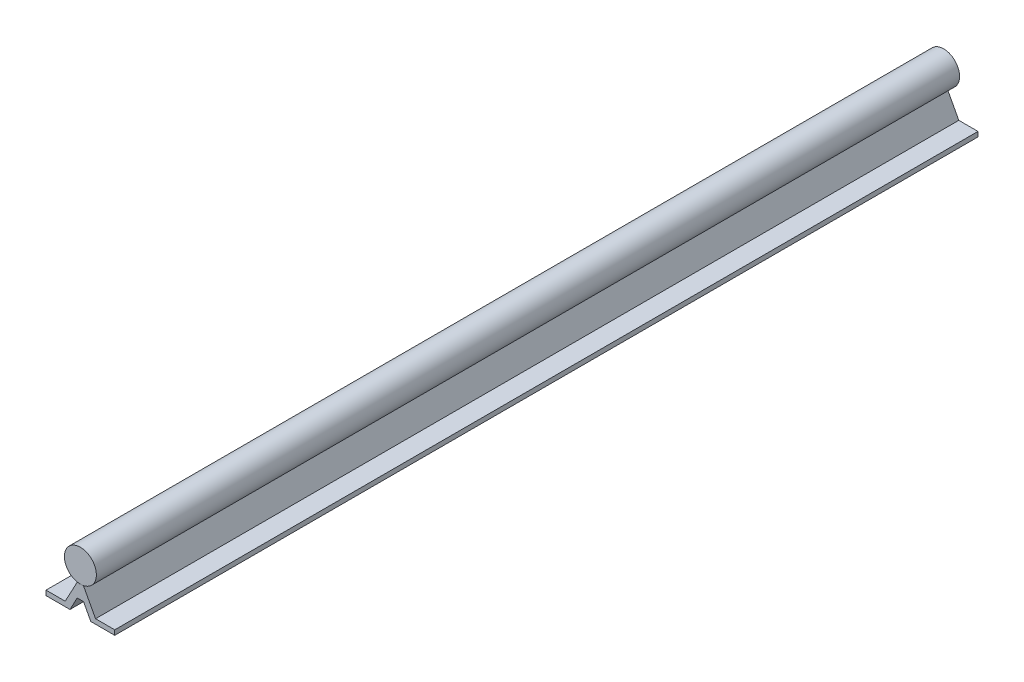
ISO-10303-21;
HEADER;
FILE_DESCRIPTION(('STEP AP214'),'2;1');
FILE_NAME('part.step','',(''),(''),'','','');
FILE_SCHEMA(('AUTOMOTIVE_DESIGN { 1 0 10303 214 1 1 1 1 }'));
ENDSEC;
DATA;
#1=APPLICATION_CONTEXT('core data for automotive mechanical design processes');
#2=APPLICATION_PROTOCOL_DEFINITION('international standard','automotive_design',2000,#1);
#3=PRODUCT_CONTEXT('',#1,'mechanical');
#4=PRODUCT('Part','Part','',(#3));
#5=PRODUCT_RELATED_PRODUCT_CATEGORY('part','',(#4));
#6=PRODUCT_DEFINITION_FORMATION('','',#4);
#7=PRODUCT_DEFINITION_CONTEXT('part definition',#1,'design');
#8=PRODUCT_DEFINITION('design','',#6,#7);
#9=PRODUCT_DEFINITION_SHAPE('','',#8);
#10=(LENGTH_UNIT() NAMED_UNIT(*) SI_UNIT(.MILLI.,.METRE.));
#11=(NAMED_UNIT(*) PLANE_ANGLE_UNIT() SI_UNIT($,.RADIAN.));
#12=(NAMED_UNIT(*) SI_UNIT($,.STERADIAN.) SOLID_ANGLE_UNIT());
#13=UNCERTAINTY_MEASURE_WITH_UNIT(LENGTH_MEASURE(1.E-05),#10,'distance_accuracy_value','');
#14=(GEOMETRIC_REPRESENTATION_CONTEXT(3) GLOBAL_UNCERTAINTY_ASSIGNED_CONTEXT((#13)) GLOBAL_UNIT_ASSIGNED_CONTEXT((#10,
#11,#12)) REPRESENTATION_CONTEXT('',''));
#15=CARTESIAN_POINT('',(0.,0.,0.));
#16=DIRECTION('',(0.,0.,1.));
#17=DIRECTION('',(1.,0.,0.));
#18=AXIS2_PLACEMENT_3D('',#15,#16,#17);
#19=CARTESIAN_POINT('',(-5.07702702702703,2.68783783783784,540.));
#20=DIRECTION('',(-0.883787916347062,0.467887720419033,0.));
#21=DIRECTION('',(-0.467887720419033,-0.883787916347062,0.));
#22=AXIS2_PLACEMENT_3D('',#19,#20,#21);
#23=PLANE('',#22);
#24=DIRECTION('',(0.467887720419033,0.883787916347062,0.));
#25=VECTOR('',#24,1.);
#26=CARTESIAN_POINT('',(-5.07702702702703,2.68783783783784,0.));
#27=LINE('',#26,#25);
#28=CARTESIAN_POINT('',(-6.5,0.,0.));
#29=VERTEX_POINT('',#28);
#30=CARTESIAN_POINT('',(-2.,8.5,0.));
#31=VERTEX_POINT('',#30);
#32=EDGE_CURVE('E167',#29,#31,#27,.T.);
#33=ORIENTED_EDGE('',*,*,#32,.T.);
#34=DIRECTION('',(0.,0.,-1.));
#35=VECTOR('',#34,1.);
#36=CARTESIAN_POINT('',(-2.,8.5,540.));
#37=LINE('',#36,#35);
#38=CARTESIAN_POINT('',(-2.,8.5,540.));
#39=VERTEX_POINT('',#38);
#40=EDGE_CURVE('E12',#39,#31,#37,.T.);
#41=ORIENTED_EDGE('',*,*,#40,.F.);
#42=DIRECTION('',(0.467887720419033,0.883787916347062,0.));
#43=VECTOR('',#42,1.);
#44=CARTESIAN_POINT('',(-5.07702702702703,2.68783783783784,540.));
#45=LINE('',#44,#43);
#46=CARTESIAN_POINT('',(-6.5,0.,540.));
#47=VERTEX_POINT('',#46);
#48=EDGE_CURVE('E197',#47,#39,#45,.T.);
#49=ORIENTED_EDGE('',*,*,#48,.F.);
#50=DIRECTION('',(0.,0.,-1.));
#51=VECTOR('',#50,1.);
#52=CARTESIAN_POINT('',(-6.5,0.,540.));
#53=LINE('',#52,#51);
#54=EDGE_CURVE('E63',#47,#29,#53,.T.);
#55=ORIENTED_EDGE('',*,*,#54,.T.);
#56=EDGE_LOOP('',(#33,#41,#49,#55));
#57=FACE_BOUND('',#56,.T.);
#58=ADVANCED_FACE('F47',(#57),#23,.F.);
#59=CARTESIAN_POINT('',(0.,8.5,540.));
#60=DIRECTION('',(0.,1.,0.));
#61=DIRECTION('',(0.,0.,1.));
#62=AXIS2_PLACEMENT_3D('',#59,#60,#61);
#63=PLANE('',#62);
#64=DIRECTION('',(1.,0.,0.));
#65=VECTOR('',#64,1.);
#66=CARTESIAN_POINT('',(0.,8.5,0.));
#67=LINE('',#66,#65);
#68=CARTESIAN_POINT('',(2.,8.5,0.));
#69=VERTEX_POINT('',#68);
#70=EDGE_CURVE('E169',#31,#69,#67,.T.);
#71=ORIENTED_EDGE('',*,*,#70,.T.);
#72=DIRECTION('',(0.,0.,-1.));
#73=VECTOR('',#72,1.);
#74=CARTESIAN_POINT('',(2.,8.5,540.));
#75=LINE('',#74,#73);
#76=CARTESIAN_POINT('',(2.,8.5,540.));
#77=VERTEX_POINT('',#76);
#78=EDGE_CURVE('E55',#77,#69,#75,.T.);
#79=ORIENTED_EDGE('',*,*,#78,.F.);
#80=DIRECTION('',(1.,0.,0.));
#81=VECTOR('',#80,1.);
#82=CARTESIAN_POINT('',(0.,8.5,540.));
#83=LINE('',#82,#81);
#84=EDGE_CURVE('E113',#39,#77,#83,.T.);
#85=ORIENTED_EDGE('',*,*,#84,.F.);
#86=ORIENTED_EDGE('',*,*,#40,.T.);
#87=EDGE_LOOP('',(#71,#79,#85,#86));
#88=FACE_BOUND('',#87,.T.);
#89=ADVANCED_FACE('F220',(#88),#63,.F.);
#90=CARTESIAN_POINT('',(5.07702702702703,2.68783783783784,540.));
#91=DIRECTION('',(-0.883787916347062,-0.467887720419032,0.));
#92=DIRECTION('',(0.467887720419032,-0.883787916347062,0.));
#93=AXIS2_PLACEMENT_3D('',#90,#91,#92);
#94=PLANE('',#93);
#95=DIRECTION('',(-0.467887720419032,0.883787916347062,0.));
#96=VECTOR('',#95,1.);
#97=CARTESIAN_POINT('',(5.07702702702703,2.68783783783784,0.));
#98=LINE('',#97,#96);
#99=CARTESIAN_POINT('',(6.5,0.,0.));
#100=VERTEX_POINT('',#99);
#101=EDGE_CURVE('E172',#100,#69,#98,.T.);
#102=ORIENTED_EDGE('',*,*,#101,.F.);
#103=DIRECTION('',(0.,0.,-1.));
#104=VECTOR('',#103,1.);
#105=CARTESIAN_POINT('',(6.5,0.,540.));
#106=LINE('',#105,#104);
#107=CARTESIAN_POINT('',(6.5,0.,540.));
#108=VERTEX_POINT('',#107);
#109=EDGE_CURVE('E213',#108,#100,#106,.T.);
#110=ORIENTED_EDGE('',*,*,#109,.F.);
#111=DIRECTION('',(-0.467887720419032,0.883787916347062,0.));
#112=VECTOR('',#111,1.);
#113=CARTESIAN_POINT('',(5.07702702702703,2.68783783783784,540.));
#114=LINE('',#113,#112);
#115=EDGE_CURVE('E219',#108,#77,#114,.T.);
#116=ORIENTED_EDGE('',*,*,#115,.T.);
#117=ORIENTED_EDGE('',*,*,#78,.T.);
#118=EDGE_LOOP('',(#102,#110,#116,#117));
#119=FACE_BOUND('',#118,.T.);
#120=ADVANCED_FACE('F217',(#119),#94,.T.);
#121=CARTESIAN_POINT('',(0.,0.,540.));
#122=DIRECTION('',(0.,1.,0.));
#123=DIRECTION('',(-1.,0.,0.));
#124=AXIS2_PLACEMENT_3D('',#121,#122,#123);
#125=PLANE('',#124);
#126=DIRECTION('',(1.,0.,0.));
#127=VECTOR('',#126,1.);
#128=CARTESIAN_POINT('',(0.,0.,0.));
#129=LINE('',#128,#127);
#130=CARTESIAN_POINT('',(21.5,-1.11022302462516E-13,0.));
#131=VERTEX_POINT('',#130);
#132=EDGE_CURVE('E175',#100,#131,#129,.T.);
#133=ORIENTED_EDGE('',*,*,#132,.T.);
#134=DIRECTION('',(0.,0.,-1.));
#135=VECTOR('',#134,1.);
#136=CARTESIAN_POINT('',(21.5,-1.11022302462516E-13,540.));
#137=LINE('',#136,#135);
#138=CARTESIAN_POINT('',(21.5,-1.11022302462516E-13,540.));
#139=VERTEX_POINT('',#138);
#140=EDGE_CURVE('E211',#139,#131,#137,.T.);
#141=ORIENTED_EDGE('',*,*,#140,.F.);
#142=DIRECTION('',(1.,0.,0.));
#143=VECTOR('',#142,1.);
#144=CARTESIAN_POINT('',(0.,0.,540.));
#145=LINE('',#144,#143);
#146=EDGE_CURVE('E232',#108,#139,#145,.T.);
#147=ORIENTED_EDGE('',*,*,#146,.F.);
#148=ORIENTED_EDGE('',*,*,#109,.T.);
#149=EDGE_LOOP('',(#133,#141,#147,#148));
#150=FACE_BOUND('',#149,.T.);
#151=ADVANCED_FACE('F229',(#150),#125,.F.);
#152=CARTESIAN_POINT('',(21.5,0.,540.));
#153=DIRECTION('',(1.,0.,0.));
#154=DIRECTION('',(0.,1.,0.));
#155=AXIS2_PLACEMENT_3D('',#152,#153,#154);
#156=PLANE('',#155);
#157=DIRECTION('',(0.,-1.,0.));
#158=VECTOR('',#157,1.);
#159=CARTESIAN_POINT('',(21.5,0.,0.));
#160=LINE('',#159,#158);
#161=CARTESIAN_POINT('',(21.5,3.,0.));
#162=VERTEX_POINT('',#161);
#163=EDGE_CURVE('E178',#162,#131,#160,.T.);
#164=ORIENTED_EDGE('',*,*,#163,.F.);
#165=DIRECTION('',(0.,0.,-1.));
#166=VECTOR('',#165,1.);
#167=CARTESIAN_POINT('',(21.5,3.,540.));
#168=LINE('',#167,#166);
#169=CARTESIAN_POINT('',(21.5,3.,540.));
#170=VERTEX_POINT('',#169);
#171=EDGE_CURVE('E209',#170,#162,#168,.T.);
#172=ORIENTED_EDGE('',*,*,#171,.F.);
#173=DIRECTION('',(0.,-1.,0.));
#174=VECTOR('',#173,1.);
#175=CARTESIAN_POINT('',(21.5,0.,540.));
#176=LINE('',#175,#174);
#177=EDGE_CURVE('E234',#170,#139,#176,.T.);
#178=ORIENTED_EDGE('',*,*,#177,.T.);
#179=ORIENTED_EDGE('',*,*,#140,.T.);
#180=EDGE_LOOP('',(#164,#172,#178,#179));
#181=FACE_BOUND('',#180,.T.);
#182=ADVANCED_FACE('F272',(#181),#156,.T.);
#183=CARTESIAN_POINT('',(0.,3.,540.));
#184=DIRECTION('',(0.,-1.,0.));
#185=DIRECTION('',(0.,0.,-1.));
#186=AXIS2_PLACEMENT_3D('',#183,#184,#185);
#187=PLANE('',#186);
#188=DIRECTION('',(-1.,0.,0.));
#189=VECTOR('',#188,1.);
#190=CARTESIAN_POINT('',(0.,3.,0.));
#191=LINE('',#190,#189);
#192=CARTESIAN_POINT('',(9.5,3.,0.));
#193=VERTEX_POINT('',#192);
#194=EDGE_CURVE('E181',#162,#193,#191,.T.);
#195=ORIENTED_EDGE('',*,*,#194,.T.);
#196=DIRECTION('',(0.,0.,-1.));
#197=VECTOR('',#196,1.);
#198=CARTESIAN_POINT('',(9.5,3.,540.));
#199=LINE('',#198,#197);
#200=CARTESIAN_POINT('',(9.5,3.,540.));
#201=VERTEX_POINT('',#200);
#202=EDGE_CURVE('E206',#201,#193,#199,.T.);
#203=ORIENTED_EDGE('',*,*,#202,.F.);
#204=DIRECTION('',(-1.,0.,0.));
#205=VECTOR('',#204,1.);
#206=CARTESIAN_POINT('',(0.,3.,540.));
#207=LINE('',#206,#205);
#208=EDGE_CURVE('E241',#170,#201,#207,.T.);
#209=ORIENTED_EDGE('',*,*,#208,.F.);
#210=ORIENTED_EDGE('',*,*,#171,.T.);
#211=EDGE_LOOP('',(#195,#203,#209,#210));
#212=FACE_BOUND('',#211,.T.);
#213=ADVANCED_FACE('F275',(#212),#187,.F.);
#214=CARTESIAN_POINT('',(8.63032705649157,4.62338949454906,540.));
#215=DIRECTION('',(-0.881479970028782,-0.472221412515419,0.));
#216=DIRECTION('',(0.472221412515419,-0.881479970028782,0.));
#217=AXIS2_PLACEMENT_3D('',#214,#215,#216);
#218=PLANE('',#217);
#219=DIRECTION('',(-0.472221412515419,0.881479970028782,0.));
#220=VECTOR('',#219,1.);
#221=CARTESIAN_POINT('',(8.63032705649157,4.62338949454906,0.));
#222=LINE('',#221,#220);
#223=CARTESIAN_POINT('',(2.,17.,0.));
#224=VERTEX_POINT('',#223);
#225=EDGE_CURVE('E183',#193,#224,#222,.T.);
#226=ORIENTED_EDGE('',*,*,#225,.T.);
#227=DIRECTION('',(0.,0.,-1.));
#228=VECTOR('',#227,1.);
#229=CARTESIAN_POINT('',(2.,17.,540.));
#230=LINE('',#229,#228);
#231=CARTESIAN_POINT('',(2.,17.,540.));
#232=VERTEX_POINT('',#231);
#233=EDGE_CURVE('E203',#232,#224,#230,.T.);
#234=ORIENTED_EDGE('',*,*,#233,.F.);
#235=DIRECTION('',(-0.472221412515419,0.881479970028782,0.));
#236=VECTOR('',#235,1.);
#237=CARTESIAN_POINT('',(8.63032705649157,4.62338949454906,540.));
#238=LINE('',#237,#236);
#239=EDGE_CURVE('E243',#201,#232,#238,.T.);
#240=ORIENTED_EDGE('',*,*,#239,.F.);
#241=ORIENTED_EDGE('',*,*,#202,.T.);
#242=EDGE_LOOP('',(#226,#234,#240,#241));
#243=FACE_BOUND('',#242,.T.);
#244=ADVANCED_FACE('F279',(#243),#218,.F.);
#245=CARTESIAN_POINT('',(0.,17.,540.));
#246=DIRECTION('',(0.,-1.,0.));
#247=DIRECTION('',(0.,0.,-1.));
#248=AXIS2_PLACEMENT_3D('',#245,#246,#247);
#249=PLANE('',#248);
#250=DIRECTION('',(-1.,0.,0.));
#251=VECTOR('',#250,1.);
#252=CARTESIAN_POINT('',(0.,17.,0.));
#253=LINE('',#252,#251);
#254=CARTESIAN_POINT('',(-2.,17.,0.));
#255=VERTEX_POINT('',#254);
#256=EDGE_CURVE('E185',#224,#255,#253,.T.);
#257=ORIENTED_EDGE('',*,*,#256,.T.);
#258=DIRECTION('',(0.,0.,-1.));
#259=VECTOR('',#258,1.);
#260=CARTESIAN_POINT('',(-2.,17.,540.));
#261=LINE('',#260,#259);
#262=CARTESIAN_POINT('',(-2.,17.,540.));
#263=VERTEX_POINT('',#262);
#264=EDGE_CURVE('E201',#263,#255,#261,.T.);
#265=ORIENTED_EDGE('',*,*,#264,.F.);
#266=DIRECTION('',(-1.,0.,0.));
#267=VECTOR('',#266,1.);
#268=CARTESIAN_POINT('',(0.,17.,540.));
#269=LINE('',#268,#267);
#270=EDGE_CURVE('E245',#232,#263,#269,.T.);
#271=ORIENTED_EDGE('',*,*,#270,.F.);
#272=ORIENTED_EDGE('',*,*,#233,.T.);
#273=EDGE_LOOP('',(#257,#265,#271,#272));
#274=FACE_BOUND('',#273,.T.);
#275=ADVANCED_FACE('F283',(#274),#249,.F.);
#276=CARTESIAN_POINT('',(-8.63032705649157,4.62338949454906,540.));
#277=DIRECTION('',(-0.881479970028782,0.472221412515419,0.));
#278=DIRECTION('',(-0.472221412515419,-0.881479970028782,0.));
#279=AXIS2_PLACEMENT_3D('',#276,#277,#278);
#280=PLANE('',#279);
#281=DIRECTION('',(0.472221412515419,0.881479970028782,0.));
#282=VECTOR('',#281,1.);
#283=CARTESIAN_POINT('',(-8.63032705649157,4.62338949454906,0.));
#284=LINE('',#283,#282);
#285=CARTESIAN_POINT('',(-9.5,3.,0.));
#286=VERTEX_POINT('',#285);
#287=EDGE_CURVE('E188',#286,#255,#284,.T.);
#288=ORIENTED_EDGE('',*,*,#287,.F.);
#289=DIRECTION('',(0.,0.,-1.));
#290=VECTOR('',#289,1.);
#291=CARTESIAN_POINT('',(-9.5,3.,540.));
#292=LINE('',#291,#290);
#293=CARTESIAN_POINT('',(-9.5,3.,540.));
#294=VERTEX_POINT('',#293);
#295=EDGE_CURVE('E150',#294,#286,#292,.T.);
#296=ORIENTED_EDGE('',*,*,#295,.F.);
#297=DIRECTION('',(0.472221412515419,0.881479970028782,0.));
#298=VECTOR('',#297,1.);
#299=CARTESIAN_POINT('',(-8.63032705649157,4.62338949454906,540.));
#300=LINE('',#299,#298);
#301=EDGE_CURVE('E159',#294,#263,#300,.T.);
#302=ORIENTED_EDGE('',*,*,#301,.T.);
#303=ORIENTED_EDGE('',*,*,#264,.T.);
#304=EDGE_LOOP('',(#288,#296,#302,#303));
#305=FACE_BOUND('',#304,.T.);
#306=ADVANCED_FACE('F248',(#305),#280,.T.);
#307=CARTESIAN_POINT('',(0.,3.,540.));
#308=DIRECTION('',(0.,1.,0.));
#309=DIRECTION('',(0.,0.,1.));
#310=AXIS2_PLACEMENT_3D('',#307,#308,#309);
#311=PLANE('',#310);
#312=DIRECTION('',(1.,0.,0.));
#313=VECTOR('',#312,1.);
#314=CARTESIAN_POINT('',(0.,3.,0.));
#315=LINE('',#314,#313);
#316=CARTESIAN_POINT('',(-21.5,3.,0.));
#317=VERTEX_POINT('',#316);
#318=EDGE_CURVE('E146',#317,#286,#315,.T.);
#319=ORIENTED_EDGE('',*,*,#318,.F.);
#320=DIRECTION('',(0.,0.,-1.));
#321=VECTOR('',#320,1.);
#322=CARTESIAN_POINT('',(-21.5,3.,540.));
#323=LINE('',#322,#321);
#324=CARTESIAN_POINT('',(-21.5,3.,540.));
#325=VERTEX_POINT('',#324);
#326=EDGE_CURVE('E141',#325,#317,#323,.T.);
#327=ORIENTED_EDGE('',*,*,#326,.F.);
#328=DIRECTION('',(1.,0.,0.));
#329=VECTOR('',#328,1.);
#330=CARTESIAN_POINT('',(0.,3.,540.));
#331=LINE('',#330,#329);
#332=EDGE_CURVE('E144',#325,#294,#331,.T.);
#333=ORIENTED_EDGE('',*,*,#332,.T.);
#334=ORIENTED_EDGE('',*,*,#295,.T.);
#335=EDGE_LOOP('',(#319,#327,#333,#334));
#336=FACE_BOUND('',#335,.T.);
#337=ADVANCED_FACE('F143',(#336),#311,.T.);
#338=CARTESIAN_POINT('',(-21.5,0.,540.));
#339=DIRECTION('',(-1.,0.,0.));
#340=DIRECTION('',(0.,-1.,0.));
#341=AXIS2_PLACEMENT_3D('',#338,#339,#340);
#342=PLANE('',#341);
#343=DIRECTION('',(0.,1.,0.));
#344=VECTOR('',#343,1.);
#345=CARTESIAN_POINT('',(-21.5,0.,0.));
#346=LINE('',#345,#344);
#347=CARTESIAN_POINT('',(-21.5,-1.11022302462516E-13,0.));
#348=VERTEX_POINT('',#347);
#349=EDGE_CURVE('E192',#348,#317,#346,.T.);
#350=ORIENTED_EDGE('',*,*,#349,.F.);
#351=DIRECTION('',(0.,0.,-1.));
#352=VECTOR('',#351,1.);
#353=CARTESIAN_POINT('',(-21.5,-1.11022302462516E-13,540.));
#354=LINE('',#353,#352);
#355=CARTESIAN_POINT('',(-21.5,-1.11022302462516E-13,540.));
#356=VERTEX_POINT('',#355);
#357=EDGE_CURVE('E101',#356,#348,#354,.T.);
#358=ORIENTED_EDGE('',*,*,#357,.F.);
#359=DIRECTION('',(0.,1.,0.));
#360=VECTOR('',#359,1.);
#361=CARTESIAN_POINT('',(-21.5,0.,540.));
#362=LINE('',#361,#360);
#363=EDGE_CURVE('E157',#356,#325,#362,.T.);
#364=ORIENTED_EDGE('',*,*,#363,.T.);
#365=ORIENTED_EDGE('',*,*,#326,.T.);
#366=EDGE_LOOP('',(#350,#358,#364,#365));
#367=FACE_BOUND('',#366,.T.);
#368=ADVANCED_FACE('F161',(#367),#342,.T.);
#369=CARTESIAN_POINT('',(0.,0.,540.));
#370=DIRECTION('',(0.,-1.,0.));
#371=DIRECTION('',(1.,0.,0.));
#372=AXIS2_PLACEMENT_3D('',#369,#370,#371);
#373=PLANE('',#372);
#374=DIRECTION('',(-1.,0.,0.));
#375=VECTOR('',#374,1.);
#376=CARTESIAN_POINT('',(0.,0.,0.));
#377=LINE('',#376,#375);
#378=EDGE_CURVE('E194',#29,#348,#377,.T.);
#379=ORIENTED_EDGE('',*,*,#378,.F.);
#380=ORIENTED_EDGE('',*,*,#54,.F.);
#381=DIRECTION('',(-1.,0.,0.));
#382=VECTOR('',#381,1.);
#383=CARTESIAN_POINT('',(0.,0.,540.));
#384=LINE('',#383,#382);
#385=EDGE_CURVE('E162',#47,#356,#384,.T.);
#386=ORIENTED_EDGE('',*,*,#385,.T.);
#387=ORIENTED_EDGE('',*,*,#357,.T.);
#388=EDGE_LOOP('',(#379,#380,#386,#387));
#389=FACE_BOUND('',#388,.T.);
#390=ADVANCED_FACE('F251',(#389),#373,.T.);
#391=CARTESIAN_POINT('',(0.,0.,540.));
#392=DIRECTION('',(0.,0.,1.));
#393=DIRECTION('',(1.,0.,0.));
#394=AXIS2_PLACEMENT_3D('',#391,#392,#393);
#395=PLANE('',#394);
#396=ORIENTED_EDGE('',*,*,#48,.T.);
#397=ORIENTED_EDGE('',*,*,#84,.T.);
#398=ORIENTED_EDGE('',*,*,#115,.F.);
#399=ORIENTED_EDGE('',*,*,#146,.T.);
#400=ORIENTED_EDGE('',*,*,#177,.F.);
#401=ORIENTED_EDGE('',*,*,#208,.T.);
#402=ORIENTED_EDGE('',*,*,#239,.T.);
#403=ORIENTED_EDGE('',*,*,#270,.T.);
#404=ORIENTED_EDGE('',*,*,#301,.F.);
#405=ORIENTED_EDGE('',*,*,#332,.F.);
#406=ORIENTED_EDGE('',*,*,#363,.F.);
#407=ORIENTED_EDGE('',*,*,#385,.F.);
#408=EDGE_LOOP('',(#396,#397,#398,#399,#400,#401,#402,#403,#404,#405,#406,#407));
#409=FACE_BOUND('',#408,.T.);
#410=ADVANCED_FACE('F155',(#409),#395,.T.);
#411=CARTESIAN_POINT('',(0.,0.,0.));
#412=DIRECTION('',(0.,0.,1.));
#413=DIRECTION('',(1.,0.,0.));
#414=AXIS2_PLACEMENT_3D('',#411,#412,#413);
#415=PLANE('',#414);
#416=ORIENTED_EDGE('',*,*,#32,.F.);
#417=ORIENTED_EDGE('',*,*,#378,.T.);
#418=ORIENTED_EDGE('',*,*,#349,.T.);
#419=ORIENTED_EDGE('',*,*,#318,.T.);
#420=ORIENTED_EDGE('',*,*,#287,.T.);
#421=ORIENTED_EDGE('',*,*,#256,.F.);
#422=ORIENTED_EDGE('',*,*,#225,.F.);
#423=ORIENTED_EDGE('',*,*,#194,.F.);
#424=ORIENTED_EDGE('',*,*,#163,.T.);
#425=ORIENTED_EDGE('',*,*,#132,.F.);
#426=ORIENTED_EDGE('',*,*,#101,.T.);
#427=ORIENTED_EDGE('',*,*,#70,.F.);
#428=EDGE_LOOP('',(#416,#417,#418,#419,#420,#421,#422,#423,#424,#425,#426,#427));
#429=FACE_BOUND('',#428,.T.);
#430=ADVANCED_FACE('F224',(#429),#415,.F.);
#431=CLOSED_SHELL('',(#58,#89,#120,#151,#182,#213,#244,#275,#306,#337,#368,#390,#410,#430));
#432=MANIFOLD_SOLID_BREP('B2',#431);
#433=CARTESIAN_POINT('',(0.,27.,540.));
#434=DIRECTION('',(0.,0.,-1.));
#435=DIRECTION('',(-1.,0.,0.));
#436=AXIS2_PLACEMENT_3D('',#433,#434,#435);
#437=CYLINDRICAL_SURFACE('',#436,10.);
#438=CARTESIAN_POINT('',(0.,27.,540.));
#439=DIRECTION('',(0.,0.,1.));
#440=DIRECTION('',(1.,0.,0.));
#441=AXIS2_PLACEMENT_3D('',#438,#439,#440);
#442=CIRCLE('',#441,10.);
#443=CARTESIAN_POINT('',(10.,27.,540.));
#444=VERTEX_POINT('',#443);
#445=EDGE_CURVE('E46',#444,#444,#442,.T.);
#446=ORIENTED_EDGE('',*,*,#445,.F.);
#447=EDGE_LOOP('',(#446));
#448=FACE_BOUND('',#447,.T.);
#449=CARTESIAN_POINT('',(0.,27.,0.));
#450=DIRECTION('',(0.,0.,1.));
#451=DIRECTION('',(1.,0.,0.));
#452=AXIS2_PLACEMENT_3D('',#449,#450,#451);
#453=CIRCLE('',#452,10.);
#454=CARTESIAN_POINT('',(10.,27.,0.));
#455=VERTEX_POINT('',#454);
#456=EDGE_CURVE('E391',#455,#455,#453,.T.);
#457=ORIENTED_EDGE('',*,*,#456,.T.);
#458=EDGE_LOOP('',(#457));
#459=FACE_BOUND('',#458,.T.);
#460=ADVANCED_FACE('F388',(#448,#459),#437,.T.);
#461=CARTESIAN_POINT('',(0.,0.,540.));
#462=DIRECTION('',(0.,0.,1.));
#463=DIRECTION('',(1.,0.,0.));
#464=AXIS2_PLACEMENT_3D('',#461,#462,#463);
#465=PLANE('',#464);
#466=ORIENTED_EDGE('',*,*,#445,.T.);
#467=EDGE_LOOP('',(#466));
#468=FACE_BOUND('',#467,.T.);
#469=ADVANCED_FACE('F403',(#468),#465,.T.);
#470=CARTESIAN_POINT('',(0.,0.,0.));
#471=DIRECTION('',(0.,0.,1.));
#472=DIRECTION('',(1.,0.,0.));
#473=AXIS2_PLACEMENT_3D('',#470,#471,#472);
#474=PLANE('',#473);
#475=ORIENTED_EDGE('',*,*,#456,.F.);
#476=EDGE_LOOP('',(#475));
#477=FACE_BOUND('',#476,.T.);
#478=ADVANCED_FACE('F401',(#477),#474,.F.);
#479=CLOSED_SHELL('',(#460,#469,#478));
#480=MANIFOLD_SOLID_BREP('B6',#479);
#481=ADVANCED_BREP_SHAPE_REPRESENTATION('',(#18,#432,#480),#14);
#482=SHAPE_DEFINITION_REPRESENTATION(#9,#481);
ENDSEC;
END-ISO-10303-21;
